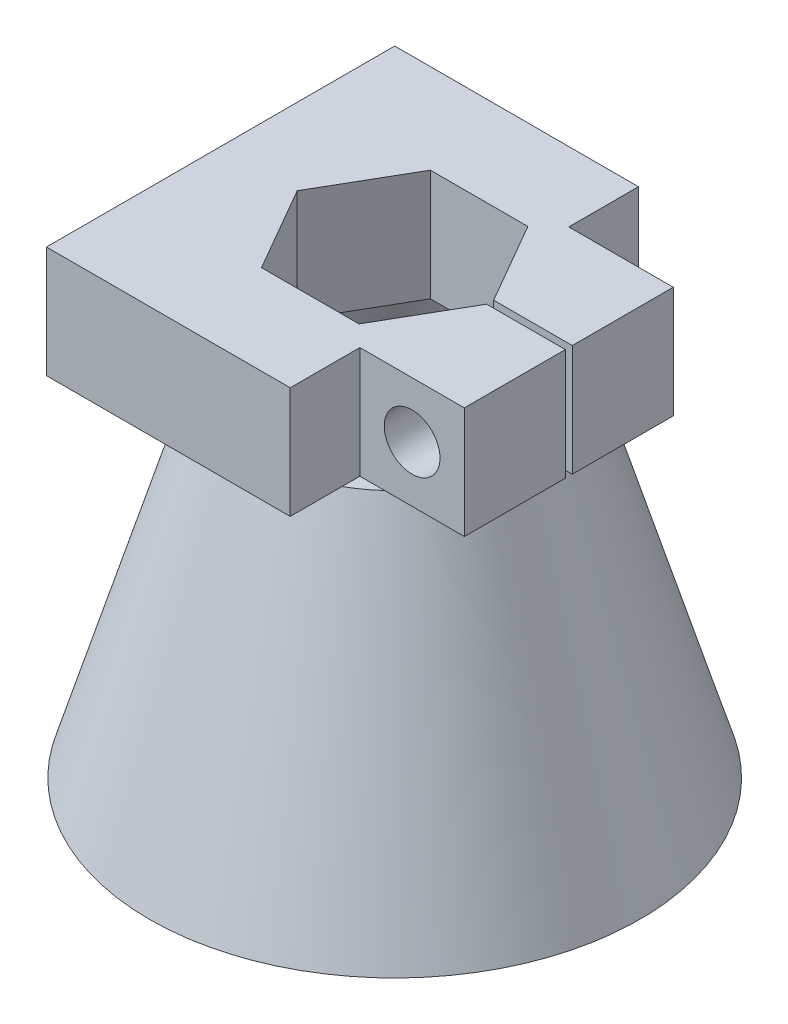
ISO-10303-21;
HEADER;
FILE_DESCRIPTION(('STEP AP214'),'2;1');
FILE_NAME('part.step','',(''),(''),'','','');
FILE_SCHEMA(('AUTOMOTIVE_DESIGN { 1 0 10303 214 1 1 1 1 }'));
ENDSEC;
DATA;
#1=APPLICATION_CONTEXT('core data for automotive mechanical design processes');
#2=APPLICATION_PROTOCOL_DEFINITION('international standard','automotive_design',2000,#1);
#3=PRODUCT_CONTEXT('',#1,'mechanical');
#4=PRODUCT('Part','Part','',(#3));
#5=PRODUCT_RELATED_PRODUCT_CATEGORY('part','',(#4));
#6=PRODUCT_DEFINITION_FORMATION('','',#4);
#7=PRODUCT_DEFINITION_CONTEXT('part definition',#1,'design');
#8=PRODUCT_DEFINITION('design','',#6,#7);
#9=PRODUCT_DEFINITION_SHAPE('','',#8);
#10=(LENGTH_UNIT() NAMED_UNIT(*) SI_UNIT(.MILLI.,.METRE.));
#11=(NAMED_UNIT(*) PLANE_ANGLE_UNIT() SI_UNIT($,.RADIAN.));
#12=(NAMED_UNIT(*) SI_UNIT($,.STERADIAN.) SOLID_ANGLE_UNIT());
#13=UNCERTAINTY_MEASURE_WITH_UNIT(LENGTH_MEASURE(1.E-05),#10,'distance_accuracy_value','');
#14=(GEOMETRIC_REPRESENTATION_CONTEXT(3) GLOBAL_UNCERTAINTY_ASSIGNED_CONTEXT((#13)) GLOBAL_UNIT_ASSIGNED_CONTEXT((#10,
#11,#12)) REPRESENTATION_CONTEXT('',''));
#15=CARTESIAN_POINT('',(0.,0.,0.));
#16=DIRECTION('',(0.,0.,1.));
#17=DIRECTION('',(1.,0.,0.));
#18=AXIS2_PLACEMENT_3D('',#15,#16,#17);
#19=CARTESIAN_POINT('',(0.,16.,0.));
#20=DIRECTION('',(0.,-1.,0.));
#21=DIRECTION('',(0.,0.,-1.));
#22=AXIS2_PLACEMENT_3D('',#19,#20,#21);
#23=PLANE('',#22);
#24=DIRECTION('',(-1.,0.,0.));
#25=VECTOR('',#24,1.);
#26=CARTESIAN_POINT('',(9.99999999999999,16.,-0.5));
#27=LINE('',#26,#25);
#28=CARTESIAN_POINT('',(25.,16.,-0.5));
#29=VERTEX_POINT('',#28);
#30=CARTESIAN_POINT('',(13.7113248654052,16.,-0.5));
#31=VERTEX_POINT('',#30);
#32=EDGE_CURVE('E201',#29,#31,#27,.T.);
#33=ORIENTED_EDGE('',*,*,#32,.F.);
#34=DIRECTION('',(0.,0.,-1.));
#35=VECTOR('',#34,1.);
#36=CARTESIAN_POINT('',(25.,16.,25.));
#37=LINE('',#36,#35);
#38=CARTESIAN_POINT('',(25.,16.,-15.));
#39=VERTEX_POINT('',#38);
#40=EDGE_CURVE('E200',#29,#39,#37,.T.);
#41=ORIENTED_EDGE('',*,*,#40,.T.);
#42=DIRECTION('',(-1.,0.,0.));
#43=VECTOR('',#42,1.);
#44=CARTESIAN_POINT('',(25.,16.,-15.));
#45=LINE('',#44,#43);
#46=CARTESIAN_POINT('',(9.99999999999999,16.,-15.));
#47=VERTEX_POINT('',#46);
#48=EDGE_CURVE('E276',#39,#47,#45,.T.);
#49=ORIENTED_EDGE('',*,*,#48,.T.);
#50=DIRECTION('',(0.,0.,-1.));
#51=VECTOR('',#50,1.);
#52=CARTESIAN_POINT('',(9.99999999999999,16.,-15.));
#53=LINE('',#52,#51);
#54=CARTESIAN_POINT('',(9.99999999999999,16.,-25.));
#55=VERTEX_POINT('',#54);
#56=EDGE_CURVE('E282',#47,#55,#53,.T.);
#57=ORIENTED_EDGE('',*,*,#56,.T.);
#58=DIRECTION('',(-1.,0.,0.));
#59=VECTOR('',#58,1.);
#60=CARTESIAN_POINT('',(-25.,16.,-25.));
#61=LINE('',#60,#59);
#62=CARTESIAN_POINT('',(-25.,16.,-25.));
#63=VERTEX_POINT('',#62);
#64=EDGE_CURVE('E358',#55,#63,#61,.T.);
#65=ORIENTED_EDGE('',*,*,#64,.T.);
#66=DIRECTION('',(0.,0.,1.));
#67=VECTOR('',#66,1.);
#68=CARTESIAN_POINT('',(-25.,16.,25.));
#69=LINE('',#68,#67);
#70=CARTESIAN_POINT('',(-25.,16.,25.));
#71=VERTEX_POINT('',#70);
#72=EDGE_CURVE('E359',#63,#71,#69,.T.);
#73=ORIENTED_EDGE('',*,*,#72,.T.);
#74=DIRECTION('',(1.,0.,0.));
#75=VECTOR('',#74,1.);
#76=CARTESIAN_POINT('',(-25.,16.,25.));
#77=LINE('',#76,#75);
#78=CARTESIAN_POINT('',(9.99999999999999,16.,25.));
#79=VERTEX_POINT('',#78);
#80=EDGE_CURVE('E216',#71,#79,#77,.T.);
#81=ORIENTED_EDGE('',*,*,#80,.T.);
#82=DIRECTION('',(0.,0.,1.));
#83=VECTOR('',#82,1.);
#84=CARTESIAN_POINT('',(9.99999999999999,16.,15.));
#85=LINE('',#84,#83);
#86=CARTESIAN_POINT('',(9.99999999999999,16.,15.));
#87=VERTEX_POINT('',#86);
#88=EDGE_CURVE('E301',#87,#79,#85,.T.);
#89=ORIENTED_EDGE('',*,*,#88,.F.);
#90=DIRECTION('',(-1.,0.,0.));
#91=VECTOR('',#90,1.);
#92=CARTESIAN_POINT('',(25.,16.,15.));
#93=LINE('',#92,#91);
#94=CARTESIAN_POINT('',(25.,16.,15.));
#95=VERTEX_POINT('',#94);
#96=EDGE_CURVE('E291',#95,#87,#93,.T.);
#97=ORIENTED_EDGE('',*,*,#96,.F.);
#98=CARTESIAN_POINT('',(25.,16.,0.5));
#99=VERTEX_POINT('',#98);
#100=EDGE_CURVE('E355',#95,#99,#37,.T.);
#101=ORIENTED_EDGE('',*,*,#100,.T.);
#102=DIRECTION('',(-1.,0.,0.));
#103=VECTOR('',#102,1.);
#104=CARTESIAN_POINT('',(9.99999999999999,16.,0.5));
#105=LINE('',#104,#103);
#106=CARTESIAN_POINT('',(13.7113248654052,16.,0.5));
#107=VERTEX_POINT('',#106);
#108=EDGE_CURVE('E192',#99,#107,#105,.T.);
#109=ORIENTED_EDGE('',*,*,#108,.T.);
#110=DIRECTION('',(0.5,0.,-0.866025403784439));
#111=VECTOR('',#110,1.);
#112=CARTESIAN_POINT('',(6.99999999999999,16.,12.1243556529821));
#113=LINE('',#112,#111);
#114=CARTESIAN_POINT('',(6.99999999999999,16.,12.1243556529821));
#115=VERTEX_POINT('',#114);
#116=EDGE_CURVE('E317',#115,#107,#113,.T.);
#117=ORIENTED_EDGE('',*,*,#116,.F.);
#118=DIRECTION('',(1.,0.,0.));
#119=VECTOR('',#118,1.);
#120=CARTESIAN_POINT('',(-7.00000000000002,16.,12.1243556529821));
#121=LINE('',#120,#119);
#122=CARTESIAN_POINT('',(-7.00000000000002,16.,12.1243556529821));
#123=VERTEX_POINT('',#122);
#124=EDGE_CURVE('E330',#123,#115,#121,.T.);
#125=ORIENTED_EDGE('',*,*,#124,.F.);
#126=DIRECTION('',(0.5,0.,0.866025403784439));
#127=VECTOR('',#126,1.);
#128=CARTESIAN_POINT('',(-14.,16.,0.));
#129=LINE('',#128,#127);
#130=CARTESIAN_POINT('',(-14.,16.,0.));
#131=VERTEX_POINT('',#130);
#132=EDGE_CURVE('E327',#131,#123,#129,.T.);
#133=ORIENTED_EDGE('',*,*,#132,.F.);
#134=DIRECTION('',(-0.5,0.,0.866025403784439));
#135=VECTOR('',#134,1.);
#136=CARTESIAN_POINT('',(-7.00000000000001,16.,-12.1243556529822));
#137=LINE('',#136,#135);
#138=CARTESIAN_POINT('',(-7.00000000000001,16.,-12.1243556529822));
#139=VERTEX_POINT('',#138);
#140=EDGE_CURVE('E325',#139,#131,#137,.T.);
#141=ORIENTED_EDGE('',*,*,#140,.F.);
#142=DIRECTION('',(-1.,0.,0.));
#143=VECTOR('',#142,1.);
#144=CARTESIAN_POINT('',(6.99999999999999,16.,-12.1243556529822));
#145=LINE('',#144,#143);
#146=CARTESIAN_POINT('',(6.99999999999999,16.,-12.1243556529822));
#147=VERTEX_POINT('',#146);
#148=EDGE_CURVE('E323',#147,#139,#145,.T.);
#149=ORIENTED_EDGE('',*,*,#148,.F.);
#150=DIRECTION('',(-0.5,0.,-0.866025403784438));
#151=VECTOR('',#150,1.);
#152=CARTESIAN_POINT('',(14.,16.,0.));
#153=LINE('',#152,#151);
#154=EDGE_CURVE('E320',#31,#147,#153,.T.);
#155=ORIENTED_EDGE('',*,*,#154,.F.);
#156=EDGE_LOOP('',(#33,#41,#49,#57,#65,#73,#81,#89,#97,#101,#109,#117,#125,#133,#141,#149,#155));
#157=FACE_BOUND('',#156,.T.);
#158=ADVANCED_FACE('F35',(#157),#23,.F.);
#159=CARTESIAN_POINT('',(0.,0.,0.));
#160=DIRECTION('',(0.,-1.,0.));
#161=DIRECTION('',(0.,0.,-1.));
#162=AXIS2_PLACEMENT_3D('',#159,#160,#161);
#163=PLANE('',#162);
#164=CARTESIAN_POINT('',(0.,0.,0.));
#165=DIRECTION('',(0.,-1.,0.));
#166=DIRECTION('',(0.,0.,-1.));
#167=AXIS2_PLACEMENT_3D('',#164,#165,#166);
#168=CIRCLE('',#167,15.);
#169=CARTESIAN_POINT('',(14.9916643505649,0.,0.5));
#170=VERTEX_POINT('',#169);
#171=CARTESIAN_POINT('',(14.9916643505649,0.,-0.5));
#172=VERTEX_POINT('',#171);
#173=EDGE_CURVE('E305',#170,#172,#168,.T.);
#174=ORIENTED_EDGE('',*,*,#173,.T.);
#175=DIRECTION('',(1.,0.,0.));
#176=VECTOR('',#175,1.);
#177=CARTESIAN_POINT('',(9.99999999999999,0.,-0.5));
#178=LINE('',#177,#176);
#179=CARTESIAN_POINT('',(13.7113248654052,0.,-0.5));
#180=VERTEX_POINT('',#179);
#181=EDGE_CURVE('E53',#180,#172,#178,.T.);
#182=ORIENTED_EDGE('',*,*,#181,.F.);
#183=DIRECTION('',(-0.5,0.,-0.866025403784438));
#184=VECTOR('',#183,1.);
#185=CARTESIAN_POINT('',(14.,0.,0.));
#186=LINE('',#185,#184);
#187=CARTESIAN_POINT('',(6.99999999999999,0.,-12.1243556529822));
#188=VERTEX_POINT('',#187);
#189=EDGE_CURVE('E335',#180,#188,#186,.T.);
#190=ORIENTED_EDGE('',*,*,#189,.T.);
#191=DIRECTION('',(-1.,0.,0.));
#192=VECTOR('',#191,1.);
#193=CARTESIAN_POINT('',(6.99999999999999,0.,-12.1243556529822));
#194=LINE('',#193,#192);
#195=CARTESIAN_POINT('',(-7.00000000000001,0.,-12.1243556529822));
#196=VERTEX_POINT('',#195);
#197=EDGE_CURVE('E337',#188,#196,#194,.T.);
#198=ORIENTED_EDGE('',*,*,#197,.T.);
#199=DIRECTION('',(-0.5,0.,0.866025403784439));
#200=VECTOR('',#199,1.);
#201=CARTESIAN_POINT('',(-7.00000000000001,0.,-12.1243556529822));
#202=LINE('',#201,#200);
#203=CARTESIAN_POINT('',(-14.,0.,0.));
#204=VERTEX_POINT('',#203);
#205=EDGE_CURVE('E340',#196,#204,#202,.T.);
#206=ORIENTED_EDGE('',*,*,#205,.T.);
#207=DIRECTION('',(0.5,0.,0.866025403784439));
#208=VECTOR('',#207,1.);
#209=CARTESIAN_POINT('',(-14.,0.,0.));
#210=LINE('',#209,#208);
#211=CARTESIAN_POINT('',(-7.00000000000002,0.,12.1243556529821));
#212=VERTEX_POINT('',#211);
#213=EDGE_CURVE('E343',#204,#212,#210,.T.);
#214=ORIENTED_EDGE('',*,*,#213,.T.);
#215=DIRECTION('',(1.,0.,0.));
#216=VECTOR('',#215,1.);
#217=CARTESIAN_POINT('',(-7.00000000000002,0.,12.1243556529821));
#218=LINE('',#217,#216);
#219=CARTESIAN_POINT('',(6.99999999999999,0.,12.1243556529821));
#220=VERTEX_POINT('',#219);
#221=EDGE_CURVE('E321',#212,#220,#218,.T.);
#222=ORIENTED_EDGE('',*,*,#221,.T.);
#223=DIRECTION('',(0.5,0.,-0.866025403784439));
#224=VECTOR('',#223,1.);
#225=CARTESIAN_POINT('',(6.99999999999999,0.,12.1243556529821));
#226=LINE('',#225,#224);
#227=CARTESIAN_POINT('',(13.7113248654052,0.,0.5));
#228=VERTEX_POINT('',#227);
#229=EDGE_CURVE('E316',#220,#228,#226,.T.);
#230=ORIENTED_EDGE('',*,*,#229,.T.);
#231=DIRECTION('',(1.,0.,0.));
#232=VECTOR('',#231,1.);
#233=CARTESIAN_POINT('',(9.99999999999999,0.,0.5));
#234=LINE('',#233,#232);
#235=EDGE_CURVE('E242',#228,#170,#234,.T.);
#236=ORIENTED_EDGE('',*,*,#235,.T.);
#237=EDGE_LOOP('',(#174,#182,#190,#198,#206,#214,#222,#230,#236));
#238=FACE_BOUND('',#237,.T.);
#239=ADVANCED_FACE('F414',(#238),#163,.T.);
#240=DIRECTION('',(0.,0.,-1.));
#241=VECTOR('',#240,1.);
#242=CARTESIAN_POINT('',(25.,0.,25.));
#243=LINE('',#242,#241);
#244=CARTESIAN_POINT('',(25.,0.,-0.5));
#245=VERTEX_POINT('',#244);
#246=CARTESIAN_POINT('',(25.,0.,-15.));
#247=VERTEX_POINT('',#246);
#248=EDGE_CURVE('E198',#245,#247,#243,.T.);
#249=ORIENTED_EDGE('',*,*,#248,.F.);
#250=CARTESIAN_POINT('',(20.213970357989,0.,-0.5));
#251=VERTEX_POINT('',#250);
#252=EDGE_CURVE('E181',#251,#245,#178,.T.);
#253=ORIENTED_EDGE('',*,*,#252,.F.);
#254=CARTESIAN_POINT('',(0.,0.,0.));
#255=DIRECTION('',(0.,-1.,0.));
#256=DIRECTION('',(0.,0.,-1.));
#257=AXIS2_PLACEMENT_3D('',#254,#255,#256);
#258=CIRCLE('',#257,20.2201532544553);
#259=CARTESIAN_POINT('',(13.5592993046713,0.,-15.));
#260=VERTEX_POINT('',#259);
#261=EDGE_CURVE('E442',#260,#251,#258,.T.);
#262=ORIENTED_EDGE('',*,*,#261,.F.);
#263=DIRECTION('',(1.,0.,0.));
#264=VECTOR('',#263,1.);
#265=CARTESIAN_POINT('',(25.,0.,-15.));
#266=LINE('',#265,#264);
#267=EDGE_CURVE('E205',#260,#247,#266,.T.);
#268=ORIENTED_EDGE('',*,*,#267,.T.);
#269=EDGE_LOOP('',(#249,#253,#262,#268));
#270=FACE_BOUND('',#269,.T.);
#271=ADVANCED_FACE('F204',(#270),#163,.T.);
#272=CARTESIAN_POINT('',(25.,16.,25.));
#273=DIRECTION('',(-1.,0.,0.));
#274=DIRECTION('',(0.,0.,1.));
#275=AXIS2_PLACEMENT_3D('',#272,#273,#274);
#276=PLANE('',#275);
#277=DIRECTION('',(0.,1.,0.));
#278=VECTOR('',#277,1.);
#279=CARTESIAN_POINT('',(25.,16.,-0.5));
#280=LINE('',#279,#278);
#281=EDGE_CURVE('E185',#245,#29,#280,.T.);
#282=ORIENTED_EDGE('',*,*,#281,.F.);
#283=ORIENTED_EDGE('',*,*,#248,.T.);
#284=DIRECTION('',(0.,1.,0.));
#285=VECTOR('',#284,1.);
#286=CARTESIAN_POINT('',(25.,16.,-15.));
#287=LINE('',#286,#285);
#288=EDGE_CURVE('E271',#247,#39,#287,.T.);
#289=ORIENTED_EDGE('',*,*,#288,.T.);
#290=ORIENTED_EDGE('',*,*,#40,.F.);
#291=EDGE_LOOP('',(#282,#283,#289,#290));
#292=FACE_BOUND('',#291,.T.);
#293=ADVANCED_FACE('F196',(#292),#276,.F.);
#294=CARTESIAN_POINT('',(14.,16.,0.));
#295=DIRECTION('',(-0.866025403784438,0.,0.5));
#296=DIRECTION('',(0.5,0.,0.866025403784438));
#297=AXIS2_PLACEMENT_3D('',#294,#295,#296);
#298=PLANE('',#297);
#299=ORIENTED_EDGE('',*,*,#189,.F.);
#300=DIRECTION('',(0.,1.,0.));
#301=VECTOR('',#300,1.);
#302=CARTESIAN_POINT('',(13.7113248654052,16.,-0.5));
#303=LINE('',#302,#301);
#304=EDGE_CURVE('E248',#180,#31,#303,.T.);
#305=ORIENTED_EDGE('',*,*,#304,.T.);
#306=ORIENTED_EDGE('',*,*,#154,.T.);
#307=DIRECTION('',(0.,-1.,0.));
#308=VECTOR('',#307,1.);
#309=CARTESIAN_POINT('',(6.99999999999999,16.,-12.1243556529822));
#310=LINE('',#309,#308);
#311=EDGE_CURVE('E207',#147,#188,#310,.T.);
#312=ORIENTED_EDGE('',*,*,#311,.T.);
#313=EDGE_LOOP('',(#299,#305,#306,#312));
#314=FACE_BOUND('',#313,.T.);
#315=ADVANCED_FACE('F434',(#314),#298,.T.);
#316=CARTESIAN_POINT('',(17.5,8.,15.));
#317=DIRECTION('',(0.,0.,1.));
#318=DIRECTION('',(1.,0.,0.));
#319=AXIS2_PLACEMENT_3D('',#316,#317,#318);
#320=CYLINDRICAL_SURFACE('',#319,2.5);
#321=CARTESIAN_POINT('',(17.5,8.,-7.));
#322=DIRECTION('',(0.,0.,-1.));
#323=DIRECTION('',(-1.,0.,0.));
#324=AXIS2_PLACEMENT_3D('',#321,#322,#323);
#325=CIRCLE('',#324,2.5);
#326=CARTESIAN_POINT('',(15.,8.,-7.));
#327=VERTEX_POINT('',#326);
#328=EDGE_CURVE('E258',#327,#327,#325,.T.);
#329=ORIENTED_EDGE('',*,*,#328,.T.);
#330=EDGE_LOOP('',(#329));
#331=FACE_BOUND('',#330,.T.);
#332=CARTESIAN_POINT('',(17.5,8.,-0.5));
#333=DIRECTION('',(0.,0.,1.));
#334=DIRECTION('',(1.,0.,0.));
#335=AXIS2_PLACEMENT_3D('',#332,#333,#334);
#336=CIRCLE('',#335,2.5);
#337=CARTESIAN_POINT('',(20.,8.,-0.5));
#338=VERTEX_POINT('',#337);
#339=EDGE_CURVE('E39',#338,#338,#336,.F.);
#340=ORIENTED_EDGE('',*,*,#339,.F.);
#341=EDGE_LOOP('',(#340));
#342=FACE_BOUND('',#341,.T.);
#343=ADVANCED_FACE('F487',(#331,#342),#320,.F.);
#344=DIRECTION('',(-1.,0.,0.));
#345=VECTOR('',#344,1.);
#346=CARTESIAN_POINT('',(-25.,0.,-25.));
#347=LINE('',#346,#345);
#348=CARTESIAN_POINT('',(9.99999999999999,0.,-25.));
#349=VERTEX_POINT('',#348);
#350=CARTESIAN_POINT('',(-25.,0.,-25.));
#351=VERTEX_POINT('',#350);
#352=EDGE_CURVE('E210',#349,#351,#347,.T.);
#353=ORIENTED_EDGE('',*,*,#352,.F.);
#354=DIRECTION('',(0.,0.,-1.));
#355=VECTOR('',#354,1.);
#356=CARTESIAN_POINT('',(9.99999999999999,0.,-15.));
#357=LINE('',#356,#355);
#358=CARTESIAN_POINT('',(9.99999999999999,0.,-17.5742595187865));
#359=VERTEX_POINT('',#358);
#360=EDGE_CURVE('E279',#359,#349,#357,.T.);
#361=ORIENTED_EDGE('',*,*,#360,.F.);
#362=CARTESIAN_POINT('',(9.99999999999999,0.,17.5742595187865));
#363=VERTEX_POINT('',#362);
#364=EDGE_CURVE('E44',#363,#359,#258,.T.);
#365=ORIENTED_EDGE('',*,*,#364,.F.);
#366=DIRECTION('',(0.,0.,1.));
#367=VECTOR('',#366,1.);
#368=CARTESIAN_POINT('',(9.99999999999999,0.,15.));
#369=LINE('',#368,#367);
#370=CARTESIAN_POINT('',(9.99999999999999,0.,25.));
#371=VERTEX_POINT('',#370);
#372=EDGE_CURVE('E306',#363,#371,#369,.T.);
#373=ORIENTED_EDGE('',*,*,#372,.T.);
#374=DIRECTION('',(1.,0.,0.));
#375=VECTOR('',#374,1.);
#376=CARTESIAN_POINT('',(-25.,0.,25.));
#377=LINE('',#376,#375);
#378=CARTESIAN_POINT('',(-25.,0.,25.));
#379=VERTEX_POINT('',#378);
#380=EDGE_CURVE('E221',#379,#371,#377,.T.);
#381=ORIENTED_EDGE('',*,*,#380,.F.);
#382=DIRECTION('',(0.,0.,1.));
#383=VECTOR('',#382,1.);
#384=CARTESIAN_POINT('',(-25.,0.,25.));
#385=LINE('',#384,#383);
#386=EDGE_CURVE('E219',#351,#379,#385,.T.);
#387=ORIENTED_EDGE('',*,*,#386,.F.);
#388=EDGE_LOOP('',(#353,#361,#365,#373,#381,#387));
#389=FACE_BOUND('',#388,.T.);
#390=ADVANCED_FACE('F378',(#389),#163,.T.);
#391=CARTESIAN_POINT('',(-25.,16.,-25.));
#392=DIRECTION('',(0.,0.,1.));
#393=DIRECTION('',(1.,0.,0.));
#394=AXIS2_PLACEMENT_3D('',#391,#392,#393);
#395=PLANE('',#394);
#396=DIRECTION('',(0.,-1.,0.));
#397=VECTOR('',#396,1.);
#398=CARTESIAN_POINT('',(9.99999999999999,16.,-25.));
#399=LINE('',#398,#397);
#400=EDGE_CURVE('E270',#55,#349,#399,.T.);
#401=ORIENTED_EDGE('',*,*,#400,.T.);
#402=ORIENTED_EDGE('',*,*,#352,.T.);
#403=DIRECTION('',(0.,-1.,0.));
#404=VECTOR('',#403,1.);
#405=CARTESIAN_POINT('',(-25.,16.,-25.));
#406=LINE('',#405,#404);
#407=EDGE_CURVE('E227',#63,#351,#406,.T.);
#408=ORIENTED_EDGE('',*,*,#407,.F.);
#409=ORIENTED_EDGE('',*,*,#64,.F.);
#410=EDGE_LOOP('',(#401,#402,#408,#409));
#411=FACE_BOUND('',#410,.T.);
#412=ADVANCED_FACE('F476',(#411),#395,.F.);
#413=CARTESIAN_POINT('',(20.213970357989,0.,0.5));
#414=VERTEX_POINT('',#413);
#415=CARTESIAN_POINT('',(25.,0.,0.5));
#416=VERTEX_POINT('',#415);
#417=EDGE_CURVE('E238',#414,#416,#234,.T.);
#418=ORIENTED_EDGE('',*,*,#417,.T.);
#419=CARTESIAN_POINT('',(25.,0.,15.));
#420=VERTEX_POINT('',#419);
#421=EDGE_CURVE('E206',#420,#416,#243,.T.);
#422=ORIENTED_EDGE('',*,*,#421,.F.);
#423=DIRECTION('',(1.,0.,0.));
#424=VECTOR('',#423,1.);
#425=CARTESIAN_POINT('',(25.,0.,15.));
#426=LINE('',#425,#424);
#427=CARTESIAN_POINT('',(13.5592993046712,0.,15.));
#428=VERTEX_POINT('',#427);
#429=EDGE_CURVE('E297',#428,#420,#426,.T.);
#430=ORIENTED_EDGE('',*,*,#429,.F.);
#431=EDGE_CURVE('E46',#414,#428,#258,.T.);
#432=ORIENTED_EDGE('',*,*,#431,.F.);
#433=EDGE_LOOP('',(#418,#422,#430,#432));
#434=FACE_BOUND('',#433,.T.);
#435=ADVANCED_FACE('F399',(#434),#163,.T.);
#436=ORIENTED_EDGE('',*,*,#421,.T.);
#437=DIRECTION('',(0.,1.,0.));
#438=VECTOR('',#437,1.);
#439=CARTESIAN_POINT('',(25.,16.,0.5));
#440=LINE('',#439,#438);
#441=EDGE_CURVE('E243',#416,#99,#440,.T.);
#442=ORIENTED_EDGE('',*,*,#441,.T.);
#443=ORIENTED_EDGE('',*,*,#100,.F.);
#444=DIRECTION('',(0.,1.,0.));
#445=VECTOR('',#444,1.);
#446=CARTESIAN_POINT('',(25.,16.,15.));
#447=LINE('',#446,#445);
#448=EDGE_CURVE('E289',#420,#95,#447,.T.);
#449=ORIENTED_EDGE('',*,*,#448,.F.);
#450=EDGE_LOOP('',(#436,#442,#443,#449));
#451=FACE_BOUND('',#450,.T.);
#452=ADVANCED_FACE('F37',(#451),#276,.F.);
#453=CARTESIAN_POINT('',(-25.,16.,25.));
#454=DIRECTION('',(1.,0.,0.));
#455=DIRECTION('',(0.,0.,-1.));
#456=AXIS2_PLACEMENT_3D('',#453,#454,#455);
#457=PLANE('',#456);
#458=ORIENTED_EDGE('',*,*,#386,.T.);
#459=DIRECTION('',(0.,-1.,0.));
#460=VECTOR('',#459,1.);
#461=CARTESIAN_POINT('',(-25.,16.,25.));
#462=LINE('',#461,#460);
#463=EDGE_CURVE('E224',#71,#379,#462,.T.);
#464=ORIENTED_EDGE('',*,*,#463,.F.);
#465=ORIENTED_EDGE('',*,*,#72,.F.);
#466=ORIENTED_EDGE('',*,*,#407,.T.);
#467=EDGE_LOOP('',(#458,#464,#465,#466));
#468=FACE_BOUND('',#467,.T.);
#469=ADVANCED_FACE('F479',(#468),#457,.F.);
#470=CARTESIAN_POINT('',(-25.,16.,25.));
#471=DIRECTION('',(0.,0.,-1.));
#472=DIRECTION('',(-1.,0.,0.));
#473=AXIS2_PLACEMENT_3D('',#470,#471,#472);
#474=PLANE('',#473);
#475=ORIENTED_EDGE('',*,*,#380,.T.);
#476=DIRECTION('',(0.,-1.,0.));
#477=VECTOR('',#476,1.);
#478=CARTESIAN_POINT('',(9.99999999999999,16.,25.));
#479=LINE('',#478,#477);
#480=EDGE_CURVE('E285',#79,#371,#479,.T.);
#481=ORIENTED_EDGE('',*,*,#480,.F.);
#482=ORIENTED_EDGE('',*,*,#80,.F.);
#483=ORIENTED_EDGE('',*,*,#463,.T.);
#484=EDGE_LOOP('',(#475,#481,#482,#483));
#485=FACE_BOUND('',#484,.T.);
#486=ADVANCED_FACE('F369',(#485),#474,.F.);
#487=CARTESIAN_POINT('',(6.99999999999999,16.,12.1243556529821));
#488=DIRECTION('',(-0.866025403784439,0.,-0.5));
#489=DIRECTION('',(-0.5,0.,0.866025403784439));
#490=AXIS2_PLACEMENT_3D('',#487,#488,#489);
#491=PLANE('',#490);
#492=DIRECTION('',(0.,1.,0.));
#493=VECTOR('',#492,1.);
#494=CARTESIAN_POINT('',(13.7113248654052,16.,0.5));
#495=LINE('',#494,#493);
#496=EDGE_CURVE('E231',#228,#107,#495,.T.);
#497=ORIENTED_EDGE('',*,*,#496,.F.);
#498=ORIENTED_EDGE('',*,*,#229,.F.);
#499=DIRECTION('',(0.,-1.,0.));
#500=VECTOR('',#499,1.);
#501=CARTESIAN_POINT('',(6.99999999999999,16.,12.1243556529821));
#502=LINE('',#501,#500);
#503=EDGE_CURVE('E332',#115,#220,#502,.T.);
#504=ORIENTED_EDGE('',*,*,#503,.F.);
#505=ORIENTED_EDGE('',*,*,#116,.T.);
#506=EDGE_LOOP('',(#497,#498,#504,#505));
#507=FACE_BOUND('',#506,.T.);
#508=ADVANCED_FACE('F408',(#507),#491,.T.);
#509=CARTESIAN_POINT('',(6.99999999999999,16.,-12.1243556529822));
#510=DIRECTION('',(0.,0.,1.));
#511=DIRECTION('',(1.,0.,0.));
#512=AXIS2_PLACEMENT_3D('',#509,#510,#511);
#513=PLANE('',#512);
#514=ORIENTED_EDGE('',*,*,#197,.F.);
#515=ORIENTED_EDGE('',*,*,#311,.F.);
#516=ORIENTED_EDGE('',*,*,#148,.T.);
#517=DIRECTION('',(0.,-1.,0.));
#518=VECTOR('',#517,1.);
#519=CARTESIAN_POINT('',(-7.00000000000001,16.,-12.1243556529822));
#520=LINE('',#519,#518);
#521=EDGE_CURVE('E212',#139,#196,#520,.T.);
#522=ORIENTED_EDGE('',*,*,#521,.T.);
#523=EDGE_LOOP('',(#514,#515,#516,#522));
#524=FACE_BOUND('',#523,.T.);
#525=ADVANCED_FACE('F430',(#524),#513,.T.);
#526=CARTESIAN_POINT('',(-7.00000000000001,16.,-12.1243556529822));
#527=DIRECTION('',(0.866025403784439,0.,0.5));
#528=DIRECTION('',(0.5,0.,-0.866025403784439));
#529=AXIS2_PLACEMENT_3D('',#526,#527,#528);
#530=PLANE('',#529);
#531=ORIENTED_EDGE('',*,*,#205,.F.);
#532=ORIENTED_EDGE('',*,*,#521,.F.);
#533=ORIENTED_EDGE('',*,*,#140,.T.);
#534=DIRECTION('',(0.,-1.,0.));
#535=VECTOR('',#534,1.);
#536=CARTESIAN_POINT('',(-14.,16.,0.));
#537=LINE('',#536,#535);
#538=EDGE_CURVE('E352',#131,#204,#537,.T.);
#539=ORIENTED_EDGE('',*,*,#538,.T.);
#540=EDGE_LOOP('',(#531,#532,#533,#539));
#541=FACE_BOUND('',#540,.T.);
#542=ADVANCED_FACE('F427',(#541),#530,.T.);
#543=CARTESIAN_POINT('',(-14.,16.,0.));
#544=DIRECTION('',(0.866025403784439,0.,-0.5));
#545=DIRECTION('',(-0.5,0.,-0.866025403784439));
#546=AXIS2_PLACEMENT_3D('',#543,#544,#545);
#547=PLANE('',#546);
#548=ORIENTED_EDGE('',*,*,#213,.F.);
#549=ORIENTED_EDGE('',*,*,#538,.F.);
#550=ORIENTED_EDGE('',*,*,#132,.T.);
#551=DIRECTION('',(0.,-1.,0.));
#552=VECTOR('',#551,1.);
#553=CARTESIAN_POINT('',(-7.00000000000002,16.,12.1243556529821));
#554=LINE('',#553,#552);
#555=EDGE_CURVE('E350',#123,#212,#554,.T.);
#556=ORIENTED_EDGE('',*,*,#555,.T.);
#557=EDGE_LOOP('',(#548,#549,#550,#556));
#558=FACE_BOUND('',#557,.T.);
#559=ADVANCED_FACE('F420',(#558),#547,.T.);
#560=CARTESIAN_POINT('',(-7.00000000000002,16.,12.1243556529821));
#561=DIRECTION('',(0.,0.,-1.));
#562=DIRECTION('',(-1.,0.,0.));
#563=AXIS2_PLACEMENT_3D('',#560,#561,#562);
#564=PLANE('',#563);
#565=ORIENTED_EDGE('',*,*,#221,.F.);
#566=ORIENTED_EDGE('',*,*,#555,.F.);
#567=ORIENTED_EDGE('',*,*,#124,.T.);
#568=ORIENTED_EDGE('',*,*,#503,.T.);
#569=EDGE_LOOP('',(#565,#566,#567,#568));
#570=FACE_BOUND('',#569,.T.);
#571=ADVANCED_FACE('F411',(#570),#564,.T.);
#572=CARTESIAN_POINT('',(0.,-50.,0.));
#573=DIRECTION('',(0.,-1.,0.));
#574=DIRECTION('',(0.,0.,-1.));
#575=AXIS2_PLACEMENT_3D('',#572,#573,#574);
#576=PLANE('',#575);
#577=CARTESIAN_POINT('',(0.,-50.,0.));
#578=DIRECTION('',(0.,-1.,0.));
#579=DIRECTION('',(0.,0.,-1.));
#580=AXIS2_PLACEMENT_3D('',#577,#578,#579);
#581=CIRCLE('',#580,30.);
#582=CARTESIAN_POINT('',(0.,-50.,-30.));
#583=VERTEX_POINT('',#582);
#584=EDGE_CURVE('E310',#583,#583,#581,.T.);
#585=ORIENTED_EDGE('',*,*,#584,.F.);
#586=EDGE_LOOP('',(#585));
#587=FACE_BOUND('',#586,.T.);
#588=CARTESIAN_POINT('',(0.,-50.,0.));
#589=DIRECTION('',(0.,-1.,0.));
#590=DIRECTION('',(0.,0.,-1.));
#591=AXIS2_PLACEMENT_3D('',#588,#589,#590);
#592=CIRCLE('',#591,35.2201532544553);
#593=CARTESIAN_POINT('',(0.,-50.,-35.2201532544553));
#594=VERTEX_POINT('',#593);
#595=EDGE_CURVE('E312',#594,#594,#592,.T.);
#596=ORIENTED_EDGE('',*,*,#595,.T.);
#597=EDGE_LOOP('',(#596));
#598=FACE_BOUND('',#597,.T.);
#599=ADVANCED_FACE('F456',(#587,#598),#576,.T.);
#600=CARTESIAN_POINT('',(0.,1.43673942783173,0.));
#601=DIRECTION('',(0.,-1.,0.));
#602=DIRECTION('',(0.,0.,-1.));
#603=AXIS2_PLACEMENT_3D('',#600,#601,#602);
#604=CONICAL_SURFACE('',#603,19.7891314261058,0.291456794477867);
#605=EDGE_CURVE('E12',#428,#363,#258,.T.);
#606=ORIENTED_EDGE('',*,*,#605,.T.);
#607=ORIENTED_EDGE('',*,*,#364,.T.);
#608=EDGE_CURVE('E384',#359,#260,#258,.T.);
#609=ORIENTED_EDGE('',*,*,#608,.T.);
#610=ORIENTED_EDGE('',*,*,#261,.T.);
#611=CARTESIAN_POINT('',(0.,0.,0.));
#612=DIRECTION('',(0.,-1.,0.));
#613=DIRECTION('',(0.,0.,-1.));
#614=AXIS2_PLACEMENT_3D('',#611,#612,#613);
#615=CIRCLE('',#614,20.2201532544553);
#616=EDGE_CURVE('E250',#414,#251,#615,.F.);
#617=ORIENTED_EDGE('',*,*,#616,.F.);
#618=ORIENTED_EDGE('',*,*,#431,.T.);
#619=EDGE_LOOP('',(#606,#607,#609,#610,#617,#618));
#620=FACE_BOUND('',#619,.T.);
#621=ORIENTED_EDGE('',*,*,#595,.F.);
#622=EDGE_LOOP('',(#621));
#623=FACE_BOUND('',#622,.T.);
#624=ADVANCED_FACE('F386',(#620,#623),#604,.T.);
#625=CARTESIAN_POINT('',(0.,0.,0.));
#626=DIRECTION('',(0.,-1.,0.));
#627=DIRECTION('',(0.,0.,-1.));
#628=AXIS2_PLACEMENT_3D('',#625,#626,#627);
#629=CONICAL_SURFACE('',#628,15.,0.291456794477867);
#630=EDGE_CURVE('E308',#172,#170,#168,.T.);
#631=ORIENTED_EDGE('',*,*,#630,.F.);
#632=ORIENTED_EDGE('',*,*,#173,.F.);
#633=EDGE_LOOP('',(#631,#632));
#634=FACE_BOUND('',#633,.T.);
#635=ORIENTED_EDGE('',*,*,#584,.T.);
#636=EDGE_LOOP('',(#635));
#637=FACE_BOUND('',#636,.T.);
#638=ADVANCED_FACE('F450',(#634,#637),#629,.F.);
#639=CARTESIAN_POINT('',(25.,0.,15.));
#640=DIRECTION('',(0.,-1.,0.));
#641=DIRECTION('',(0.,0.,-1.));
#642=AXIS2_PLACEMENT_3D('',#639,#640,#641);
#643=PLANE('',#642);
#644=ORIENTED_EDGE('',*,*,#605,.F.);
#645=CARTESIAN_POINT('',(9.99999999999999,0.,15.));
#646=VERTEX_POINT('',#645);
#647=EDGE_CURVE('E298',#646,#428,#426,.T.);
#648=ORIENTED_EDGE('',*,*,#647,.F.);
#649=EDGE_CURVE('E303',#646,#363,#369,.T.);
#650=ORIENTED_EDGE('',*,*,#649,.T.);
#651=EDGE_LOOP('',(#644,#648,#650));
#652=FACE_BOUND('',#651,.T.);
#653=ADVANCED_FACE('F392',(#652),#643,.F.);
#654=CARTESIAN_POINT('',(9.99999999999999,16.,15.));
#655=DIRECTION('',(-1.,0.,0.));
#656=DIRECTION('',(0.,0.,1.));
#657=AXIS2_PLACEMENT_3D('',#654,#655,#656);
#658=PLANE('',#657);
#659=ORIENTED_EDGE('',*,*,#480,.T.);
#660=ORIENTED_EDGE('',*,*,#372,.F.);
#661=ORIENTED_EDGE('',*,*,#649,.F.);
#662=DIRECTION('',(0.,-1.,0.));
#663=VECTOR('',#662,1.);
#664=CARTESIAN_POINT('',(9.99999999999999,16.,15.));
#665=LINE('',#664,#663);
#666=EDGE_CURVE('E294',#87,#646,#665,.T.);
#667=ORIENTED_EDGE('',*,*,#666,.F.);
#668=ORIENTED_EDGE('',*,*,#88,.T.);
#669=EDGE_LOOP('',(#659,#660,#661,#667,#668));
#670=FACE_BOUND('',#669,.T.);
#671=ADVANCED_FACE('F374',(#670),#658,.F.);
#672=CARTESIAN_POINT('',(0.,0.,15.));
#673=DIRECTION('',(0.,0.,-1.));
#674=DIRECTION('',(-1.,0.,0.));
#675=AXIS2_PLACEMENT_3D('',#672,#673,#674);
#676=PLANE('',#675);
#677=CARTESIAN_POINT('',(17.5,8.,15.));
#678=DIRECTION('',(0.,0.,1.));
#679=DIRECTION('',(1.,0.,0.));
#680=AXIS2_PLACEMENT_3D('',#677,#678,#679);
#681=CIRCLE('',#680,4.);
#682=CARTESIAN_POINT('',(21.5,8.,15.));
#683=VERTEX_POINT('',#682);
#684=EDGE_CURVE('E261',#683,#683,#681,.T.);
#685=ORIENTED_EDGE('',*,*,#684,.F.);
#686=EDGE_LOOP('',(#685));
#687=FACE_BOUND('',#686,.T.);
#688=ORIENTED_EDGE('',*,*,#448,.T.);
#689=ORIENTED_EDGE('',*,*,#96,.T.);
#690=ORIENTED_EDGE('',*,*,#666,.T.);
#691=ORIENTED_EDGE('',*,*,#647,.T.);
#692=ORIENTED_EDGE('',*,*,#429,.T.);
#693=EDGE_LOOP('',(#688,#689,#690,#691,#692));
#694=FACE_BOUND('',#693,.T.);
#695=ADVANCED_FACE('F395',(#687,#694),#676,.F.);
#696=CARTESIAN_POINT('',(9.99999999999999,16.,-15.));
#697=DIRECTION('',(1.,0.,0.));
#698=DIRECTION('',(0.,0.,-1.));
#699=AXIS2_PLACEMENT_3D('',#696,#697,#698);
#700=PLANE('',#699);
#701=ORIENTED_EDGE('',*,*,#400,.F.);
#702=ORIENTED_EDGE('',*,*,#56,.F.);
#703=DIRECTION('',(0.,-1.,0.));
#704=VECTOR('',#703,1.);
#705=CARTESIAN_POINT('',(9.99999999999999,16.,-15.));
#706=LINE('',#705,#704);
#707=CARTESIAN_POINT('',(9.99999999999999,0.,-15.));
#708=VERTEX_POINT('',#707);
#709=EDGE_CURVE('E274',#47,#708,#706,.T.);
#710=ORIENTED_EDGE('',*,*,#709,.T.);
#711=EDGE_CURVE('E286',#708,#359,#357,.T.);
#712=ORIENTED_EDGE('',*,*,#711,.T.);
#713=ORIENTED_EDGE('',*,*,#360,.T.);
#714=EDGE_LOOP('',(#701,#702,#710,#712,#713));
#715=FACE_BOUND('',#714,.T.);
#716=ADVANCED_FACE('F440',(#715),#700,.T.);
#717=CARTESIAN_POINT('',(25.,0.,-15.));
#718=DIRECTION('',(0.,1.,0.));
#719=DIRECTION('',(0.,0.,1.));
#720=AXIS2_PLACEMENT_3D('',#717,#718,#719);
#721=PLANE('',#720);
#722=ORIENTED_EDGE('',*,*,#711,.F.);
#723=EDGE_CURVE('E61',#708,#260,#266,.T.);
#724=ORIENTED_EDGE('',*,*,#723,.T.);
#725=ORIENTED_EDGE('',*,*,#608,.F.);
#726=EDGE_LOOP('',(#722,#724,#725));
#727=FACE_BOUND('',#726,.T.);
#728=ADVANCED_FACE('F441',(#727),#721,.T.);
#729=CARTESIAN_POINT('',(0.,0.,-15.));
#730=DIRECTION('',(0.,0.,1.));
#731=DIRECTION('',(-1.,0.,0.));
#732=AXIS2_PLACEMENT_3D('',#729,#730,#731);
#733=PLANE('',#732);
#734=CARTESIAN_POINT('',(17.5,8.,-15.));
#735=DIRECTION('',(0.,0.,-1.));
#736=DIRECTION('',(-1.,0.,0.));
#737=AXIS2_PLACEMENT_3D('',#734,#735,#736);
#738=CIRCLE('',#737,4.);
#739=CARTESIAN_POINT('',(13.5,8.,-15.));
#740=VERTEX_POINT('',#739);
#741=EDGE_CURVE('E252',#740,#740,#738,.T.);
#742=ORIENTED_EDGE('',*,*,#741,.F.);
#743=EDGE_LOOP('',(#742));
#744=FACE_BOUND('',#743,.T.);
#745=ORIENTED_EDGE('',*,*,#288,.F.);
#746=ORIENTED_EDGE('',*,*,#267,.F.);
#747=ORIENTED_EDGE('',*,*,#723,.F.);
#748=ORIENTED_EDGE('',*,*,#709,.F.);
#749=ORIENTED_EDGE('',*,*,#48,.F.);
#750=EDGE_LOOP('',(#745,#746,#747,#748,#749));
#751=FACE_BOUND('',#750,.T.);
#752=ADVANCED_FACE('F438',(#744,#751),#733,.F.);
#753=CARTESIAN_POINT('',(17.5,8.,0.5));
#754=DIRECTION('',(0.,0.,1.));
#755=DIRECTION('',(1.,0.,0.));
#756=AXIS2_PLACEMENT_3D('',#753,#754,#755);
#757=CIRCLE('',#756,2.5);
#758=CARTESIAN_POINT('',(20.,8.,0.5));
#759=VERTEX_POINT('',#758);
#760=EDGE_CURVE('E229',#759,#759,#757,.F.);
#761=ORIENTED_EDGE('',*,*,#760,.T.);
#762=EDGE_LOOP('',(#761));
#763=FACE_BOUND('',#762,.T.);
#764=CARTESIAN_POINT('',(17.5,8.,7.));
#765=DIRECTION('',(0.,0.,1.));
#766=DIRECTION('',(1.,0.,0.));
#767=AXIS2_PLACEMENT_3D('',#764,#765,#766);
#768=CIRCLE('',#767,2.5);
#769=CARTESIAN_POINT('',(20.,8.,7.));
#770=VERTEX_POINT('',#769);
#771=EDGE_CURVE('E267',#770,#770,#768,.T.);
#772=ORIENTED_EDGE('',*,*,#771,.T.);
#773=EDGE_LOOP('',(#772));
#774=FACE_BOUND('',#773,.T.);
#775=ADVANCED_FACE('F495',(#763,#774),#320,.F.);
#776=CARTESIAN_POINT('',(20.,8.,7.));
#777=DIRECTION('',(0.,0.,-1.));
#778=DIRECTION('',(-1.,0.,0.));
#779=AXIS2_PLACEMENT_3D('',#776,#777,#778);
#780=PLANE('',#779);
#781=ORIENTED_EDGE('',*,*,#771,.F.);
#782=EDGE_LOOP('',(#781));
#783=FACE_BOUND('',#782,.T.);
#784=CARTESIAN_POINT('',(17.5,8.,7.));
#785=DIRECTION('',(0.,0.,1.));
#786=DIRECTION('',(1.,0.,0.));
#787=AXIS2_PLACEMENT_3D('',#784,#785,#786);
#788=CIRCLE('',#787,4.);
#789=CARTESIAN_POINT('',(21.5,8.,7.));
#790=VERTEX_POINT('',#789);
#791=EDGE_CURVE('E264',#790,#790,#788,.T.);
#792=ORIENTED_EDGE('',*,*,#791,.T.);
#793=EDGE_LOOP('',(#792));
#794=FACE_BOUND('',#793,.T.);
#795=ADVANCED_FACE('F624',(#783,#794),#780,.F.);
#796=CARTESIAN_POINT('',(17.5,8.,15.));
#797=DIRECTION('',(0.,0.,1.));
#798=DIRECTION('',(1.,0.,0.));
#799=AXIS2_PLACEMENT_3D('',#796,#797,#798);
#800=CYLINDRICAL_SURFACE('',#799,4.);
#801=ORIENTED_EDGE('',*,*,#791,.F.);
#802=EDGE_LOOP('',(#801));
#803=FACE_BOUND('',#802,.T.);
#804=ORIENTED_EDGE('',*,*,#684,.T.);
#805=EDGE_LOOP('',(#804));
#806=FACE_BOUND('',#805,.T.);
#807=ADVANCED_FACE('F631',(#803,#806),#800,.F.);
#808=CARTESIAN_POINT('',(20.,8.,-7.));
#809=DIRECTION('',(0.,0.,1.));
#810=DIRECTION('',(1.,0.,0.));
#811=AXIS2_PLACEMENT_3D('',#808,#809,#810);
#812=PLANE('',#811);
#813=ORIENTED_EDGE('',*,*,#328,.F.);
#814=EDGE_LOOP('',(#813));
#815=FACE_BOUND('',#814,.T.);
#816=CARTESIAN_POINT('',(17.5,8.,-7.));
#817=DIRECTION('',(0.,0.,-1.));
#818=DIRECTION('',(-1.,0.,0.));
#819=AXIS2_PLACEMENT_3D('',#816,#817,#818);
#820=CIRCLE('',#819,4.);
#821=CARTESIAN_POINT('',(13.5,8.,-7.));
#822=VERTEX_POINT('',#821);
#823=EDGE_CURVE('E255',#822,#822,#820,.T.);
#824=ORIENTED_EDGE('',*,*,#823,.T.);
#825=EDGE_LOOP('',(#824));
#826=FACE_BOUND('',#825,.T.);
#827=ADVANCED_FACE('F639',(#815,#826),#812,.F.);
#828=CARTESIAN_POINT('',(17.5,8.,-15.));
#829=DIRECTION('',(0.,0.,-1.));
#830=DIRECTION('',(-1.,0.,0.));
#831=AXIS2_PLACEMENT_3D('',#828,#829,#830);
#832=CYLINDRICAL_SURFACE('',#831,4.);
#833=ORIENTED_EDGE('',*,*,#823,.F.);
#834=EDGE_LOOP('',(#833));
#835=FACE_BOUND('',#834,.T.);
#836=ORIENTED_EDGE('',*,*,#741,.T.);
#837=EDGE_LOOP('',(#836));
#838=FACE_BOUND('',#837,.T.);
#839=ADVANCED_FACE('F647',(#835,#838),#832,.F.);
#840=CARTESIAN_POINT('',(9.99999999999999,0.,-0.5));
#841=DIRECTION('',(0.,-1.,0.));
#842=DIRECTION('',(0.,0.,-1.));
#843=AXIS2_PLACEMENT_3D('',#840,#841,#842);
#844=PLANE('',#843);
#845=ORIENTED_EDGE('',*,*,#616,.T.);
#846=EDGE_CURVE('E187',#172,#251,#178,.T.);
#847=ORIENTED_EDGE('',*,*,#846,.F.);
#848=ORIENTED_EDGE('',*,*,#630,.T.);
#849=EDGE_CURVE('E241',#170,#414,#234,.T.);
#850=ORIENTED_EDGE('',*,*,#849,.T.);
#851=EDGE_LOOP('',(#845,#847,#848,#850));
#852=FACE_BOUND('',#851,.T.);
#853=ADVANCED_FACE('F445',(#852),#844,.F.);
#854=CARTESIAN_POINT('',(0.,0.,-0.5));
#855=DIRECTION('',(0.,0.,1.));
#856=DIRECTION('',(1.,0.,0.));
#857=AXIS2_PLACEMENT_3D('',#854,#855,#856);
#858=PLANE('',#857);
#859=ORIENTED_EDGE('',*,*,#181,.T.);
#860=ORIENTED_EDGE('',*,*,#846,.T.);
#861=ORIENTED_EDGE('',*,*,#252,.T.);
#862=ORIENTED_EDGE('',*,*,#281,.T.);
#863=ORIENTED_EDGE('',*,*,#32,.T.);
#864=ORIENTED_EDGE('',*,*,#304,.F.);
#865=EDGE_LOOP('',(#859,#860,#861,#862,#863,#864));
#866=FACE_BOUND('',#865,.T.);
#867=ORIENTED_EDGE('',*,*,#339,.T.);
#868=EDGE_LOOP('',(#867));
#869=FACE_BOUND('',#868,.T.);
#870=ADVANCED_FACE('F183',(#866,#869),#858,.T.);
#871=CARTESIAN_POINT('',(0.,0.,0.5));
#872=DIRECTION('',(0.,0.,1.));
#873=DIRECTION('',(1.,0.,0.));
#874=AXIS2_PLACEMENT_3D('',#871,#872,#873);
#875=PLANE('',#874);
#876=ORIENTED_EDGE('',*,*,#496,.T.);
#877=ORIENTED_EDGE('',*,*,#108,.F.);
#878=ORIENTED_EDGE('',*,*,#441,.F.);
#879=ORIENTED_EDGE('',*,*,#417,.F.);
#880=ORIENTED_EDGE('',*,*,#849,.F.);
#881=ORIENTED_EDGE('',*,*,#235,.F.);
#882=EDGE_LOOP('',(#876,#877,#878,#879,#880,#881));
#883=FACE_BOUND('',#882,.T.);
#884=ORIENTED_EDGE('',*,*,#760,.F.);
#885=EDGE_LOOP('',(#884));
#886=FACE_BOUND('',#885,.T.);
#887=ADVANCED_FACE('F697',(#883,#886),#875,.F.);
#888=CLOSED_SHELL('',(#158,#239,#271,#293,#315,#343,#390,#412,#435,#452,#469,#486,#508,#525,
#542,#559,#571,#599,#624,#638,#653,#671,#695,#716,#728,#752,#775,#795,#807,#827,#839,#853,#870,#887));
#889=MANIFOLD_SOLID_BREP('B2',#888);
#890=ADVANCED_BREP_SHAPE_REPRESENTATION('',(#18,#889),#14);
#891=SHAPE_DEFINITION_REPRESENTATION(#9,#890);
ENDSEC;
END-ISO-10303-21;
